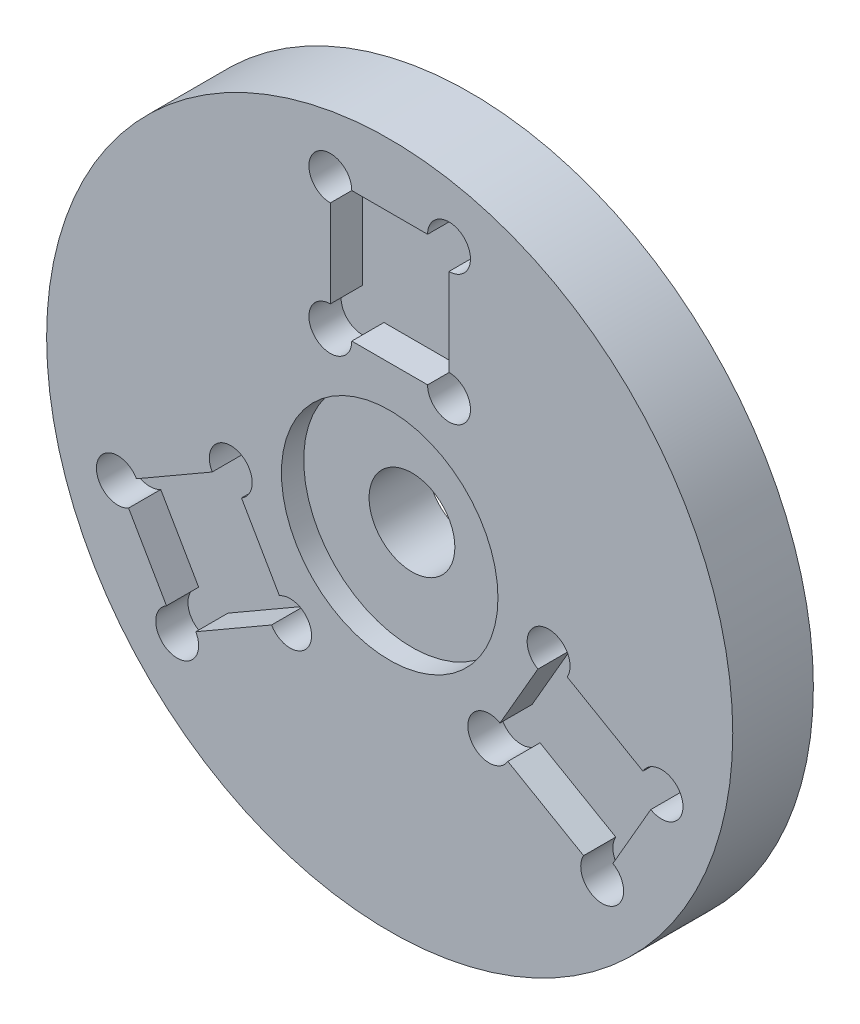
ISO-10303-21;
HEADER;
FILE_DESCRIPTION(('STEP AP214'),'2;1');
FILE_NAME('part.step','',(''),(''),'','','');
FILE_SCHEMA(('AUTOMOTIVE_DESIGN { 1 0 10303 214 1 1 1 1 }'));
ENDSEC;
DATA;
#1=APPLICATION_CONTEXT('core data for automotive mechanical design processes');
#2=APPLICATION_PROTOCOL_DEFINITION('international standard','automotive_design',2000,#1);
#3=PRODUCT_CONTEXT('',#1,'mechanical');
#4=PRODUCT('Part','Part','',(#3));
#5=PRODUCT_RELATED_PRODUCT_CATEGORY('part','',(#4));
#6=PRODUCT_DEFINITION_FORMATION('','',#4);
#7=PRODUCT_DEFINITION_CONTEXT('part definition',#1,'design');
#8=PRODUCT_DEFINITION('design','',#6,#7);
#9=PRODUCT_DEFINITION_SHAPE('','',#8);
#10=(LENGTH_UNIT() NAMED_UNIT(*) SI_UNIT(.MILLI.,.METRE.));
#11=(NAMED_UNIT(*) PLANE_ANGLE_UNIT() SI_UNIT($,.RADIAN.));
#12=(NAMED_UNIT(*) SI_UNIT($,.STERADIAN.) SOLID_ANGLE_UNIT());
#13=UNCERTAINTY_MEASURE_WITH_UNIT(LENGTH_MEASURE(1.E-05),#10,'distance_accuracy_value','');
#14=(GEOMETRIC_REPRESENTATION_CONTEXT(3) GLOBAL_UNCERTAINTY_ASSIGNED_CONTEXT((#13)) GLOBAL_UNIT_ASSIGNED_CONTEXT((#10,
#11,#12)) REPRESENTATION_CONTEXT('',''));
#15=CARTESIAN_POINT('',(0.,0.,0.));
#16=DIRECTION('',(0.,0.,1.));
#17=DIRECTION('',(1.,0.,0.));
#18=AXIS2_PLACEMENT_3D('',#15,#16,#17);
#19=CARTESIAN_POINT('',(0.,0.,11.938));
#20=DIRECTION('',(0.,0.,-1.));
#21=DIRECTION('',(-1.,0.,0.));
#22=AXIS2_PLACEMENT_3D('',#19,#20,#21);
#23=CYLINDRICAL_SURFACE('',#22,50.8);
#24=CARTESIAN_POINT('',(0.,0.,11.938));
#25=DIRECTION('',(0.,0.,1.));
#26=DIRECTION('',(1.,0.,0.));
#27=AXIS2_PLACEMENT_3D('',#24,#25,#26);
#28=CIRCLE('',#27,50.8);
#29=CARTESIAN_POINT('',(50.8,0.,11.938));
#30=VERTEX_POINT('',#29);
#31=EDGE_CURVE('E11',#30,#30,#28,.T.);
#32=ORIENTED_EDGE('',*,*,#31,.F.);
#33=EDGE_LOOP('',(#32));
#34=FACE_BOUND('',#33,.T.);
#35=CARTESIAN_POINT('',(0.,0.,0.));
#36=DIRECTION('',(0.,0.,1.));
#37=DIRECTION('',(1.,0.,0.));
#38=AXIS2_PLACEMENT_3D('',#35,#36,#37);
#39=CIRCLE('',#38,50.8);
#40=CARTESIAN_POINT('',(50.8,0.,0.));
#41=VERTEX_POINT('',#40);
#42=EDGE_CURVE('E40',#41,#41,#39,.T.);
#43=ORIENTED_EDGE('',*,*,#42,.T.);
#44=EDGE_LOOP('',(#43));
#45=FACE_BOUND('',#44,.T.);
#46=ADVANCED_FACE('F32',(#34,#45),#23,.T.);
#47=CARTESIAN_POINT('',(0.,0.,11.938));
#48=DIRECTION('',(0.,0.,1.));
#49=DIRECTION('',(1.,0.,0.));
#50=AXIS2_PLACEMENT_3D('',#47,#48,#49);
#51=PLANE('',#50);
#52=CARTESIAN_POINT('',(-14.7435993349946,-18.6593368653508,11.938));
#53=DIRECTION('',(0.,0.,1.));
#54=DIRECTION('',(-0.499999999999992,0.866025403784443,0.));
#55=AXIS2_PLACEMENT_3D('',#52,#53,#54);
#56=CIRCLE('',#55,3.175);
#57=CARTESIAN_POINT('',(-17.4932299920102,-20.2468368653508,11.938));
#58=VERTEX_POINT('',#57);
#59=CARTESIAN_POINT('',(-16.3310993349946,-15.9097062083352,11.938));
#60=VERTEX_POINT('',#59);
#61=EDGE_CURVE('E202',#58,#60,#56,.T.);
#62=ORIENTED_EDGE('',*,*,#61,.F.);
#63=DIRECTION('',(0.866025403784443,0.499999999999992,0.));
#64=VECTOR('',#63,1.);
#65=CARTESIAN_POINT('',(-31.4613537296495,-28.3113368653507,11.938));
#66=LINE('',#65,#64);
#67=CARTESIAN_POINT('',(-28.7117230726339,-26.7238368653507,11.938));
#68=VERTEX_POINT('',#67);
#69=EDGE_CURVE('E211',#68,#58,#66,.T.);
#70=ORIENTED_EDGE('',*,*,#69,.F.);
#71=CARTESIAN_POINT('',(-31.4613537296495,-28.3113368653507,11.938));
#72=DIRECTION('',(0.,0.,1.));
#73=DIRECTION('',(-0.499999999999992,0.866025403784443,0.));
#74=AXIS2_PLACEMENT_3D('',#71,#72,#73);
#75=CIRCLE('',#74,3.175);
#76=CARTESIAN_POINT('',(-33.0488537296495,-25.5617062083351,11.938));
#77=VERTEX_POINT('',#76);
#78=EDGE_CURVE('E678',#77,#68,#75,.T.);
#79=ORIENTED_EDGE('',*,*,#78,.F.);
#80=DIRECTION('',(0.499999999999992,-0.866025403784443,0.));
#81=VECTOR('',#80,1.);
#82=CARTESIAN_POINT('',(-31.4613537296495,-28.3113368653507,11.938));
#83=LINE('',#82,#81);
#84=CARTESIAN_POINT('',(-38.6615138053176,-15.8402937916643,11.938));
#85=VERTEX_POINT('',#84);
#86=EDGE_CURVE('E228',#85,#77,#83,.T.);
#87=ORIENTED_EDGE('',*,*,#86,.F.);
#88=CARTESIAN_POINT('',(-40.2490138053176,-13.0906631346487,11.938));
#89=DIRECTION('',(0.,0.,1.));
#90=DIRECTION('',(-0.499999999999992,0.866025403784443,0.));
#91=AXIS2_PLACEMENT_3D('',#88,#89,#90);
#92=CIRCLE('',#91,3.175);
#93=CARTESIAN_POINT('',(-37.499383148302,-11.5031631346487,11.938));
#94=VERTEX_POINT('',#93);
#95=EDGE_CURVE('E669',#94,#85,#92,.T.);
#96=ORIENTED_EDGE('',*,*,#95,.F.);
#97=DIRECTION('',(-0.866025403784443,-0.499999999999992,0.));
#98=VECTOR('',#97,1.);
#99=CARTESIAN_POINT('',(-40.2490138053176,-13.0906631346487,11.938));
#100=LINE('',#99,#98);
#101=CARTESIAN_POINT('',(-26.2808900676783,-5.0261631346488,11.938));
#102=VERTEX_POINT('',#101);
#103=EDGE_CURVE('E226',#102,#94,#100,.T.);
#104=ORIENTED_EDGE('',*,*,#103,.F.);
#105=CARTESIAN_POINT('',(-23.5312594106627,-3.43866313464882,11.938));
#106=DIRECTION('',(0.,0.,1.));
#107=DIRECTION('',(-0.499999999999992,0.866025403784443,0.));
#108=AXIS2_PLACEMENT_3D('',#105,#106,#107);
#109=CIRCLE('',#108,3.175);
#110=CARTESIAN_POINT('',(-21.9437594106627,-6.18829379166443,11.938));
#111=VERTEX_POINT('',#110);
#112=EDGE_CURVE('E658',#111,#102,#109,.T.);
#113=ORIENTED_EDGE('',*,*,#112,.F.);
#114=DIRECTION('',(-0.499999999999992,0.866025403784443,0.));
#115=VECTOR('',#114,1.);
#116=CARTESIAN_POINT('',(-14.7435993349946,-18.6593368653508,11.938));
#117=LINE('',#116,#115);
#118=EDGE_CURVE('E232',#60,#111,#117,.T.);
#119=ORIENTED_EDGE('',*,*,#118,.F.);
#120=EDGE_LOOP('',(#62,#70,#79,#87,#96,#104,#113,#119));
#121=FACE_BOUND('',#120,.T.);
#122=CARTESIAN_POINT('',(23.5312594106626,-3.43866313464915,11.938));
#123=DIRECTION('',(0.,0.,1.));
#124=DIRECTION('',(-0.500000000000004,-0.866025403784436,0.));
#125=AXIS2_PLACEMENT_3D('',#122,#123,#124);
#126=CIRCLE('',#125,3.175);
#127=CARTESIAN_POINT('',(26.2808900676782,-5.02616313464916,11.938));
#128=VERTEX_POINT('',#127);
#129=CARTESIAN_POINT('',(21.9437594106626,-6.18829379166474,11.938));
#130=VERTEX_POINT('',#129);
#131=EDGE_CURVE('E686',#128,#130,#126,.T.);
#132=ORIENTED_EDGE('',*,*,#131,.F.);
#133=DIRECTION('',(-0.866025403784436,0.500000000000004,0.));
#134=VECTOR('',#133,1.);
#135=CARTESIAN_POINT('',(40.2490138053174,-13.0906631346492,11.938));
#136=LINE('',#135,#134);
#137=CARTESIAN_POINT('',(37.4993831483018,-11.5031631346492,11.938));
#138=VERTEX_POINT('',#137);
#139=EDGE_CURVE('E248',#138,#128,#136,.T.);
#140=ORIENTED_EDGE('',*,*,#139,.F.);
#141=CARTESIAN_POINT('',(40.2490138053174,-13.0906631346492,11.938));
#142=DIRECTION('',(0.,0.,1.));
#143=DIRECTION('',(-0.500000000000004,-0.866025403784436,0.));
#144=AXIS2_PLACEMENT_3D('',#141,#142,#143);
#145=CIRCLE('',#144,3.175);
#146=CARTESIAN_POINT('',(38.6615138053174,-15.8402937916648,11.938));
#147=VERTEX_POINT('',#146);
#148=EDGE_CURVE('E716',#147,#138,#145,.T.);
#149=ORIENTED_EDGE('',*,*,#148,.F.);
#150=DIRECTION('',(0.500000000000004,0.866025403784436,0.));
#151=VECTOR('',#150,1.);
#152=CARTESIAN_POINT('',(40.2490138053174,-13.0906631346492,11.938));
#153=LINE('',#152,#151);
#154=CARTESIAN_POINT('',(33.0488537296491,-25.5617062083355,11.938));
#155=VERTEX_POINT('',#154);
#156=EDGE_CURVE('E246',#155,#147,#153,.T.);
#157=ORIENTED_EDGE('',*,*,#156,.F.);
#158=CARTESIAN_POINT('',(31.4613537296491,-28.3113368653511,11.938));
#159=DIRECTION('',(0.,0.,1.));
#160=DIRECTION('',(-0.500000000000004,-0.866025403784436,0.));
#161=AXIS2_PLACEMENT_3D('',#158,#159,#160);
#162=CIRCLE('',#161,3.175);
#163=CARTESIAN_POINT('',(28.7117230726335,-26.7238368653511,11.938));
#164=VERTEX_POINT('',#163);
#165=EDGE_CURVE('E707',#164,#155,#162,.T.);
#166=ORIENTED_EDGE('',*,*,#165,.F.);
#167=DIRECTION('',(0.866025403784437,-0.500000000000004,0.));
#168=VECTOR('',#167,1.);
#169=CARTESIAN_POINT('',(31.4613537296491,-28.3113368653511,11.938));
#170=LINE('',#169,#168);
#171=CARTESIAN_POINT('',(17.4932299920099,-20.246836865351,11.938));
#172=VERTEX_POINT('',#171);
#173=EDGE_CURVE('E220',#172,#164,#170,.T.);
#174=ORIENTED_EDGE('',*,*,#173,.F.);
#175=CARTESIAN_POINT('',(14.7435993349943,-18.659336865351,11.938));
#176=DIRECTION('',(0.,0.,1.));
#177=DIRECTION('',(-0.500000000000004,-0.866025403784436,0.));
#178=AXIS2_PLACEMENT_3D('',#175,#176,#177);
#179=CIRCLE('',#178,3.175);
#180=CARTESIAN_POINT('',(16.3310993349943,-15.9097062083354,11.938));
#181=VERTEX_POINT('',#180);
#182=EDGE_CURVE('E696',#181,#172,#179,.T.);
#183=ORIENTED_EDGE('',*,*,#182,.F.);
#184=DIRECTION('',(-0.500000000000004,-0.866025403784436,0.));
#185=VECTOR('',#184,1.);
#186=CARTESIAN_POINT('',(23.5312594106626,-3.43866313464915,11.938));
#187=LINE('',#186,#185);
#188=EDGE_CURVE('E237',#130,#181,#187,.T.);
#189=ORIENTED_EDGE('',*,*,#188,.F.);
#190=EDGE_LOOP('',(#132,#140,#149,#157,#166,#174,#183,#189));
#191=FACE_BOUND('',#190,.T.);
#192=CARTESIAN_POINT('',(-8.78766007566822,22.098,11.938));
#193=DIRECTION('',(0.,0.,1.));
#194=DIRECTION('',(1.,0.,0.));
#195=AXIS2_PLACEMENT_3D('',#192,#193,#194);
#196=CIRCLE('',#195,3.175);
#197=CARTESIAN_POINT('',(-8.78766007566822,25.273,11.938));
#198=VERTEX_POINT('',#197);
#199=CARTESIAN_POINT('',(-5.61266007566822,22.098,11.938));
#200=VERTEX_POINT('',#199);
#201=EDGE_CURVE('E244',#198,#200,#196,.T.);
#202=ORIENTED_EDGE('',*,*,#201,.F.);
#203=DIRECTION('',(0.,-1.,0.));
#204=VECTOR('',#203,1.);
#205=CARTESIAN_POINT('',(-8.78766007566822,41.402,11.938));
#206=LINE('',#205,#204);
#207=CARTESIAN_POINT('',(-8.78766007566822,38.227,11.938));
#208=VERTEX_POINT('',#207);
#209=EDGE_CURVE('E309',#208,#198,#206,.T.);
#210=ORIENTED_EDGE('',*,*,#209,.F.);
#211=CARTESIAN_POINT('',(-8.78766007566822,41.402,11.938));
#212=DIRECTION('',(0.,0.,1.));
#213=DIRECTION('',(1.,0.,0.));
#214=AXIS2_PLACEMENT_3D('',#211,#212,#213);
#215=CIRCLE('',#214,3.175);
#216=CARTESIAN_POINT('',(-5.61266007566822,41.402,11.938));
#217=VERTEX_POINT('',#216);
#218=EDGE_CURVE('E283',#217,#208,#215,.T.);
#219=ORIENTED_EDGE('',*,*,#218,.F.);
#220=DIRECTION('',(-1.,0.,0.));
#221=VECTOR('',#220,1.);
#222=CARTESIAN_POINT('',(-8.78766007566822,41.402,11.938));
#223=LINE('',#222,#221);
#224=CARTESIAN_POINT('',(5.61266007566821,41.402,11.938));
#225=VERTEX_POINT('',#224);
#226=EDGE_CURVE('E307',#225,#217,#223,.T.);
#227=ORIENTED_EDGE('',*,*,#226,.F.);
#228=CARTESIAN_POINT('',(8.78766007566821,41.402,11.938));
#229=DIRECTION('',(0.,0.,1.));
#230=DIRECTION('',(1.,0.,0.));
#231=AXIS2_PLACEMENT_3D('',#228,#229,#230);
#232=CIRCLE('',#231,3.175);
#233=CARTESIAN_POINT('',(8.78766007566821,38.227,11.938));
#234=VERTEX_POINT('',#233);
#235=EDGE_CURVE('E272',#234,#225,#232,.T.);
#236=ORIENTED_EDGE('',*,*,#235,.F.);
#237=DIRECTION('',(0.,1.,0.));
#238=VECTOR('',#237,1.);
#239=CARTESIAN_POINT('',(8.78766007566821,41.402,11.938));
#240=LINE('',#239,#238);
#241=CARTESIAN_POINT('',(8.78766007566822,25.273,11.938));
#242=VERTEX_POINT('',#241);
#243=EDGE_CURVE('E294',#242,#234,#240,.T.);
#244=ORIENTED_EDGE('',*,*,#243,.F.);
#245=CARTESIAN_POINT('',(8.78766007566822,22.098,11.938));
#246=DIRECTION('',(0.,0.,1.));
#247=DIRECTION('',(1.,0.,0.));
#248=AXIS2_PLACEMENT_3D('',#245,#246,#247);
#249=CIRCLE('',#248,3.175);
#250=CARTESIAN_POINT('',(5.61266007566822,22.098,11.938));
#251=VERTEX_POINT('',#250);
#252=EDGE_CURVE('E261',#251,#242,#249,.T.);
#253=ORIENTED_EDGE('',*,*,#252,.F.);
#254=DIRECTION('',(1.,0.,0.));
#255=VECTOR('',#254,1.);
#256=CARTESIAN_POINT('',(-8.78766007566822,22.098,11.938));
#257=LINE('',#256,#255);
#258=EDGE_CURVE('E298',#200,#251,#257,.T.);
#259=ORIENTED_EDGE('',*,*,#258,.F.);
#260=EDGE_LOOP('',(#202,#210,#219,#227,#236,#244,#253,#259));
#261=FACE_BOUND('',#260,.T.);
#262=CARTESIAN_POINT('',(0.,0.,11.938));
#263=DIRECTION('',(0.,0.,1.));
#264=DIRECTION('',(1.,0.,0.));
#265=AXIS2_PLACEMENT_3D('',#262,#263,#264);
#266=CIRCLE('',#265,16.03375);
#267=CARTESIAN_POINT('',(16.03375,0.,11.938));
#268=VERTEX_POINT('',#267);
#269=EDGE_CURVE('E305',#268,#268,#266,.T.);
#270=ORIENTED_EDGE('',*,*,#269,.F.);
#271=EDGE_LOOP('',(#270));
#272=FACE_BOUND('',#271,.T.);
#273=ORIENTED_EDGE('',*,*,#31,.T.);
#274=EDGE_LOOP('',(#273));
#275=FACE_BOUND('',#274,.T.);
#276=ADVANCED_FACE('F324',(#121,#191,#261,#272,#275),#51,.T.);
#277=CARTESIAN_POINT('',(0.,0.,0.));
#278=DIRECTION('',(0.,0.,1.));
#279=DIRECTION('',(1.,0.,0.));
#280=AXIS2_PLACEMENT_3D('',#277,#278,#279);
#281=PLANE('',#280);
#282=CARTESIAN_POINT('',(0.,0.,0.));
#283=DIRECTION('',(0.,0.,1.));
#284=DIRECTION('',(1.,0.,0.));
#285=AXIS2_PLACEMENT_3D('',#282,#283,#284);
#286=CIRCLE('',#285,6.35);
#287=CARTESIAN_POINT('',(6.35,0.,0.));
#288=VERTEX_POINT('',#287);
#289=EDGE_CURVE('E653',#288,#288,#286,.T.);
#290=ORIENTED_EDGE('',*,*,#289,.T.);
#291=EDGE_LOOP('',(#290));
#292=FACE_BOUND('',#291,.T.);
#293=ORIENTED_EDGE('',*,*,#42,.F.);
#294=EDGE_LOOP('',(#293));
#295=FACE_BOUND('',#294,.T.);
#296=ADVANCED_FACE('F321',(#292,#295),#281,.F.);
#297=CARTESIAN_POINT('',(0.,0.,8.636));
#298=DIRECTION('',(0.,0.,1.));
#299=DIRECTION('',(1.,0.,0.));
#300=AXIS2_PLACEMENT_3D('',#297,#298,#299);
#301=CYLINDRICAL_SURFACE('',#300,16.03375);
#302=CARTESIAN_POINT('',(0.,0.,8.636));
#303=DIRECTION('',(0.,0.,1.));
#304=DIRECTION('',(1.,0.,0.));
#305=AXIS2_PLACEMENT_3D('',#302,#303,#304);
#306=CIRCLE('',#305,16.03375);
#307=CARTESIAN_POINT('',(16.03375,0.,8.636));
#308=VERTEX_POINT('',#307);
#309=EDGE_CURVE('E313',#308,#308,#306,.T.);
#310=CARTESIAN_POINT('',(16.03375,0.,8.636));
#311=CARTESIAN_POINT('',(16.03375,0.,8.67039583333333));
#312=CARTESIAN_POINT('',(16.03375,0.,8.70479166666667));
#313=CARTESIAN_POINT('',(16.03375,0.,8.77358333333333));
#314=CARTESIAN_POINT('',(16.03375,0.,8.80797916666667));
#315=CARTESIAN_POINT('',(16.03375,0.,8.87677083333333));
#316=CARTESIAN_POINT('',(16.03375,0.,8.91116666666667));
#317=CARTESIAN_POINT('',(16.03375,0.,8.97995833333333));
#318=CARTESIAN_POINT('',(16.03375,0.,9.01435416666667));
#319=CARTESIAN_POINT('',(16.03375,0.,9.08314583333333));
#320=CARTESIAN_POINT('',(16.03375,0.,9.11754166666667));
#321=CARTESIAN_POINT('',(16.03375,0.,9.18633333333333));
#322=CARTESIAN_POINT('',(16.03375,0.,9.22072916666666));
#323=CARTESIAN_POINT('',(16.03375,0.,9.28952083333333));
#324=CARTESIAN_POINT('',(16.03375,0.,9.32391666666667));
#325=CARTESIAN_POINT('',(16.03375,0.,9.39270833333333));
#326=CARTESIAN_POINT('',(16.03375,0.,9.42710416666666));
#327=CARTESIAN_POINT('',(16.03375,0.,9.49589583333333));
#328=CARTESIAN_POINT('',(16.03375,0.,9.53029166666667));
#329=CARTESIAN_POINT('',(16.03375,0.,9.59908333333333));
#330=CARTESIAN_POINT('',(16.03375,0.,9.63347916666667));
#331=CARTESIAN_POINT('',(16.03375,0.,9.70227083333333));
#332=CARTESIAN_POINT('',(16.03375,0.,9.73666666666667));
#333=CARTESIAN_POINT('',(16.03375,0.,9.80545833333333));
#334=CARTESIAN_POINT('',(16.03375,0.,9.83985416666667));
#335=CARTESIAN_POINT('',(16.03375,0.,9.90864583333333));
#336=CARTESIAN_POINT('',(16.03375,0.,9.94304166666667));
#337=CARTESIAN_POINT('',(16.03375,0.,10.0118333333333));
#338=CARTESIAN_POINT('',(16.03375,0.,10.0462291666667));
#339=CARTESIAN_POINT('',(16.03375,0.,10.1150208333333));
#340=CARTESIAN_POINT('',(16.03375,0.,10.1494166666667));
#341=CARTESIAN_POINT('',(16.03375,0.,10.2182083333333));
#342=CARTESIAN_POINT('',(16.03375,0.,10.2526041666667));
#343=CARTESIAN_POINT('',(16.03375,0.,10.3213958333333));
#344=CARTESIAN_POINT('',(16.03375,0.,10.3557916666667));
#345=CARTESIAN_POINT('',(16.03375,0.,10.4245833333333));
#346=CARTESIAN_POINT('',(16.03375,0.,10.4589791666667));
#347=CARTESIAN_POINT('',(16.03375,0.,10.5277708333333));
#348=CARTESIAN_POINT('',(16.03375,0.,10.5621666666667));
#349=CARTESIAN_POINT('',(16.03375,0.,10.6309583333333));
#350=CARTESIAN_POINT('',(16.03375,0.,10.6653541666667));
#351=CARTESIAN_POINT('',(16.03375,0.,10.7341458333333));
#352=CARTESIAN_POINT('',(16.03375,0.,10.7685416666667));
#353=CARTESIAN_POINT('',(16.03375,0.,10.8373333333333));
#354=CARTESIAN_POINT('',(16.03375,0.,10.8717291666667));
#355=CARTESIAN_POINT('',(16.03375,0.,10.9405208333333));
#356=CARTESIAN_POINT('',(16.03375,0.,10.9749166666667));
#357=CARTESIAN_POINT('',(16.03375,0.,11.0437083333333));
#358=CARTESIAN_POINT('',(16.03375,0.,11.0781041666667));
#359=CARTESIAN_POINT('',(16.03375,0.,11.1468958333333));
#360=CARTESIAN_POINT('',(16.03375,0.,11.1812916666667));
#361=CARTESIAN_POINT('',(16.03375,0.,11.2500833333333));
#362=CARTESIAN_POINT('',(16.03375,0.,11.2844791666667));
#363=CARTESIAN_POINT('',(16.03375,0.,11.3532708333333));
#364=CARTESIAN_POINT('',(16.03375,0.,11.3876666666667));
#365=CARTESIAN_POINT('',(16.03375,0.,11.4564583333333));
#366=CARTESIAN_POINT('',(16.03375,0.,11.4908541666667));
#367=CARTESIAN_POINT('',(16.03375,0.,11.5596458333333));
#368=CARTESIAN_POINT('',(16.03375,0.,11.5940416666667));
#369=CARTESIAN_POINT('',(16.03375,0.,11.6628333333333));
#370=CARTESIAN_POINT('',(16.03375,0.,11.6972291666667));
#371=CARTESIAN_POINT('',(16.03375,0.,11.7660208333333));
#372=CARTESIAN_POINT('',(16.03375,0.,11.8004166666667));
#373=CARTESIAN_POINT('',(16.03375,0.,11.8692083333333));
#374=CARTESIAN_POINT('',(16.03375,0.,11.9036041666667));
#375=CARTESIAN_POINT('',(16.03375,0.,11.938));
#376=B_SPLINE_CURVE_WITH_KNOTS('',3,(#310,#311,#312,#313,#314,#315,#316,#317,#318,#319,#320,
#321,#322,#323,#324,#325,#326,#327,#328,#329,#330,#331,#332,#333,#334,#335,#336,#337,#338,#339,
#340,#341,#342,#343,#344,#345,#346,#347,#348,#349,#350,#351,#352,#353,#354,#355,#356,#357,#358,
#359,#360,#361,#362,#363,#364,#365,#366,#367,#368,#369,#370,#371,#372,#373,#374,#375),
.UNSPECIFIED.,.F.,.F.,(4,2,2,2,2,2,2,2,2,2,2,2,2,2,2,2,2,2,2,2,2,2,2,2,2,2,2,2,2,2,2,2,4),(0.,
0.103187500000001,0.206375000000002,0.309562500000001,0.412750000000002,0.515937500000001,
0.619125000000002,0.722312500000001,0.825500000000002,0.928687500000001,1.031875,1.1350625,
1.23825,1.3414375,1.444625,1.5478125,1.651,1.7541875,1.857375,1.9605625,2.06375,2.1669375,
2.270125,2.3733125,2.4765,2.5796875,2.682875,2.7860625,2.88925,2.9924375,3.095625,3.1988125,
3.302),.UNSPECIFIED.);
#377=EDGE_CURVE('BSEAM323',#308,#268,#376,.T.);
#378=ORIENTED_EDGE('',*,*,#309,.F.);
#379=ORIENTED_EDGE('',*,*,#269,.T.);
#380=ORIENTED_EDGE('',*,*,#377,.T.);
#381=ORIENTED_EDGE('',*,*,#377,.F.);
#382=EDGE_LOOP('',(#378,#380,#379,#381));
#383=FACE_BOUND('',#382,.T.);
#384=ADVANCED_FACE('F323',(#383),#301,.F.);
#385=CARTESIAN_POINT('',(0.,0.,8.636));
#386=DIRECTION('',(0.,0.,1.));
#387=DIRECTION('',(1.,0.,0.));
#388=AXIS2_PLACEMENT_3D('',#385,#386,#387);
#389=PLANE('',#388);
#390=CARTESIAN_POINT('',(0.,0.,8.636));
#391=DIRECTION('',(0.,0.,1.));
#392=DIRECTION('',(1.,0.,0.));
#393=AXIS2_PLACEMENT_3D('',#390,#391,#392);
#394=CIRCLE('',#393,6.35);
#395=CARTESIAN_POINT('',(6.35,0.,8.636));
#396=VERTEX_POINT('',#395);
#397=EDGE_CURVE('E35',#396,#396,#394,.T.);
#398=ORIENTED_EDGE('',*,*,#397,.F.);
#399=EDGE_LOOP('',(#398));
#400=FACE_BOUND('',#399,.T.);
#401=ORIENTED_EDGE('',*,*,#309,.T.);
#402=EDGE_LOOP('',(#401));
#403=FACE_BOUND('',#402,.T.);
#404=ADVANCED_FACE('F331',(#400,#403),#389,.T.);
#405=CARTESIAN_POINT('',(8.78766007566821,41.402,7.1755));
#406=DIRECTION('',(1.,0.,0.));
#407=DIRECTION('',(0.,1.,0.));
#408=AXIS2_PLACEMENT_3D('',#405,#406,#407);
#409=PLANE('',#408);
#410=DIRECTION('',(0.,1.,0.));
#411=VECTOR('',#410,1.);
#412=CARTESIAN_POINT('',(8.78766007566821,41.402,7.1755));
#413=LINE('',#412,#411);
#414=CARTESIAN_POINT('',(8.78766007566822,25.273,7.1755));
#415=VERTEX_POINT('',#414);
#416=CARTESIAN_POINT('',(8.78766007566821,38.227,7.1755));
#417=VERTEX_POINT('',#416);
#418=EDGE_CURVE('E295',#415,#417,#413,.T.);
#419=ORIENTED_EDGE('',*,*,#418,.F.);
#420=DIRECTION('',(0.,0.,1.));
#421=VECTOR('',#420,1.);
#422=CARTESIAN_POINT('',(8.78766007566822,25.273,-1.80475612106916));
#423=LINE('',#422,#421);
#424=EDGE_CURVE('E269',#415,#242,#423,.T.);
#425=ORIENTED_EDGE('',*,*,#424,.T.);
#426=ORIENTED_EDGE('',*,*,#243,.T.);
#427=DIRECTION('',(0.,0.,1.));
#428=VECTOR('',#427,1.);
#429=CARTESIAN_POINT('',(8.78766007566821,38.227,-1.80475612106916));
#430=LINE('',#429,#428);
#431=EDGE_CURVE('E280',#234,#417,#430,.F.);
#432=ORIENTED_EDGE('',*,*,#431,.T.);
#433=EDGE_LOOP('',(#419,#425,#426,#432));
#434=FACE_BOUND('',#433,.T.);
#435=ADVANCED_FACE('F367',(#434),#409,.F.);
#436=CARTESIAN_POINT('',(-8.78766007566822,22.098,7.1755));
#437=DIRECTION('',(0.,-1.,0.));
#438=DIRECTION('',(0.,0.,-1.));
#439=AXIS2_PLACEMENT_3D('',#436,#437,#438);
#440=PLANE('',#439);
#441=DIRECTION('',(1.,0.,0.));
#442=VECTOR('',#441,1.);
#443=CARTESIAN_POINT('',(-8.78766007566822,22.098,7.1755));
#444=LINE('',#443,#442);
#445=CARTESIAN_POINT('',(-5.61266007566822,22.098,7.1755));
#446=VERTEX_POINT('',#445);
#447=CARTESIAN_POINT('',(5.61266007566822,22.098,7.1755));
#448=VERTEX_POINT('',#447);
#449=EDGE_CURVE('E303',#446,#448,#444,.T.);
#450=ORIENTED_EDGE('',*,*,#449,.F.);
#451=DIRECTION('',(0.,0.,1.));
#452=VECTOR('',#451,1.);
#453=CARTESIAN_POINT('',(-5.61266007566822,22.098,-1.80475612106916));
#454=LINE('',#453,#452);
#455=EDGE_CURVE('E258',#446,#200,#454,.T.);
#456=ORIENTED_EDGE('',*,*,#455,.T.);
#457=ORIENTED_EDGE('',*,*,#258,.T.);
#458=DIRECTION('',(0.,0.,1.));
#459=VECTOR('',#458,1.);
#460=CARTESIAN_POINT('',(5.61266007566822,22.098,-1.80475612106916));
#461=LINE('',#460,#459);
#462=EDGE_CURVE('E266',#251,#448,#461,.F.);
#463=ORIENTED_EDGE('',*,*,#462,.T.);
#464=EDGE_LOOP('',(#450,#456,#457,#463));
#465=FACE_BOUND('',#464,.T.);
#466=ADVANCED_FACE('F377',(#465),#440,.F.);
#467=CARTESIAN_POINT('',(-8.78766007566822,41.402,7.1755));
#468=DIRECTION('',(-1.,0.,0.));
#469=DIRECTION('',(0.,-1.,0.));
#470=AXIS2_PLACEMENT_3D('',#467,#468,#469);
#471=PLANE('',#470);
#472=ORIENTED_EDGE('',*,*,#209,.T.);
#473=DIRECTION('',(0.,0.,1.));
#474=VECTOR('',#473,1.);
#475=CARTESIAN_POINT('',(-8.78766007566822,25.273,-1.80475612106916));
#476=LINE('',#475,#474);
#477=CARTESIAN_POINT('',(-8.78766007566822,25.273,7.1755));
#478=VERTEX_POINT('',#477);
#479=EDGE_CURVE('E255',#198,#478,#476,.F.);
#480=ORIENTED_EDGE('',*,*,#479,.T.);
#481=DIRECTION('',(0.,-1.,0.));
#482=VECTOR('',#481,1.);
#483=CARTESIAN_POINT('',(-8.78766007566822,41.402,7.1755));
#484=LINE('',#483,#482);
#485=CARTESIAN_POINT('',(-8.78766007566822,38.227,7.1755));
#486=VERTEX_POINT('',#485);
#487=EDGE_CURVE('E300',#486,#478,#484,.T.);
#488=ORIENTED_EDGE('',*,*,#487,.F.);
#489=DIRECTION('',(0.,0.,1.));
#490=VECTOR('',#489,1.);
#491=CARTESIAN_POINT('',(-8.78766007566822,38.227,-1.80475612106916));
#492=LINE('',#491,#490);
#493=EDGE_CURVE('E291',#486,#208,#492,.T.);
#494=ORIENTED_EDGE('',*,*,#493,.T.);
#495=EDGE_LOOP('',(#472,#480,#488,#494));
#496=FACE_BOUND('',#495,.T.);
#497=ADVANCED_FACE('F384',(#496),#471,.F.);
#498=CARTESIAN_POINT('',(-8.78766007566822,41.402,7.1755));
#499=DIRECTION('',(0.,1.,0.));
#500=DIRECTION('',(0.,0.,1.));
#501=AXIS2_PLACEMENT_3D('',#498,#499,#500);
#502=PLANE('',#501);
#503=DIRECTION('',(-1.,0.,0.));
#504=VECTOR('',#503,1.);
#505=CARTESIAN_POINT('',(-8.78766007566822,41.402,7.1755));
#506=LINE('',#505,#504);
#507=CARTESIAN_POINT('',(5.61266007566821,41.402,7.1755));
#508=VERTEX_POINT('',#507);
#509=CARTESIAN_POINT('',(-5.61266007566822,41.402,7.1755));
#510=VERTEX_POINT('',#509);
#511=EDGE_CURVE('E297',#508,#510,#506,.T.);
#512=ORIENTED_EDGE('',*,*,#511,.F.);
#513=DIRECTION('',(0.,0.,1.));
#514=VECTOR('',#513,1.);
#515=CARTESIAN_POINT('',(5.61266007566821,41.402,-1.80475612106916));
#516=LINE('',#515,#514);
#517=EDGE_CURVE('E277',#508,#225,#516,.T.);
#518=ORIENTED_EDGE('',*,*,#517,.T.);
#519=ORIENTED_EDGE('',*,*,#226,.T.);
#520=DIRECTION('',(0.,0.,1.));
#521=VECTOR('',#520,1.);
#522=CARTESIAN_POINT('',(-5.61266007566822,41.402,-1.80475612106916));
#523=LINE('',#522,#521);
#524=EDGE_CURVE('E288',#217,#510,#523,.F.);
#525=ORIENTED_EDGE('',*,*,#524,.T.);
#526=EDGE_LOOP('',(#512,#518,#519,#525));
#527=FACE_BOUND('',#526,.T.);
#528=ADVANCED_FACE('F392',(#527),#502,.F.);
#529=CARTESIAN_POINT('',(0.,0.,7.1755));
#530=DIRECTION('',(0.,0.,1.));
#531=DIRECTION('',(1.,0.,0.));
#532=AXIS2_PLACEMENT_3D('',#529,#530,#531);
#533=PLANE('',#532);
#534=CARTESIAN_POINT('',(-8.78766007566822,22.098,7.1755));
#535=DIRECTION('',(0.,0.,1.));
#536=DIRECTION('',(1.,0.,0.));
#537=AXIS2_PLACEMENT_3D('',#534,#535,#536);
#538=CIRCLE('',#537,3.175);
#539=EDGE_CURVE('E253',#446,#478,#538,.F.);
#540=ORIENTED_EDGE('',*,*,#539,.F.);
#541=ORIENTED_EDGE('',*,*,#449,.T.);
#542=CARTESIAN_POINT('',(8.78766007566822,22.098,7.1755));
#543=DIRECTION('',(0.,0.,1.));
#544=DIRECTION('',(1.,0.,0.));
#545=AXIS2_PLACEMENT_3D('',#542,#543,#544);
#546=CIRCLE('',#545,3.175);
#547=EDGE_CURVE('E263',#415,#448,#546,.F.);
#548=ORIENTED_EDGE('',*,*,#547,.F.);
#549=ORIENTED_EDGE('',*,*,#418,.T.);
#550=CARTESIAN_POINT('',(8.78766007566821,41.402,7.1755));
#551=DIRECTION('',(0.,0.,1.));
#552=DIRECTION('',(1.,0.,0.));
#553=AXIS2_PLACEMENT_3D('',#550,#551,#552);
#554=CIRCLE('',#553,3.175);
#555=EDGE_CURVE('E274',#508,#417,#554,.F.);
#556=ORIENTED_EDGE('',*,*,#555,.F.);
#557=ORIENTED_EDGE('',*,*,#511,.T.);
#558=CARTESIAN_POINT('',(-8.78766007566822,41.402,7.1755));
#559=DIRECTION('',(0.,0.,1.));
#560=DIRECTION('',(1.,0.,0.));
#561=AXIS2_PLACEMENT_3D('',#558,#559,#560);
#562=CIRCLE('',#561,3.175);
#563=EDGE_CURVE('E285',#486,#510,#562,.F.);
#564=ORIENTED_EDGE('',*,*,#563,.F.);
#565=ORIENTED_EDGE('',*,*,#487,.T.);
#566=EDGE_LOOP('',(#540,#541,#548,#549,#556,#557,#564,#565));
#567=FACE_BOUND('',#566,.T.);
#568=ADVANCED_FACE('F400',(#567),#533,.T.);
#569=CARTESIAN_POINT('',(-8.78766007566822,41.402,-1.80475612106916));
#570=DIRECTION('',(0.,0.,1.));
#571=DIRECTION('',(1.,0.,0.));
#572=AXIS2_PLACEMENT_3D('',#569,#570,#571);
#573=CYLINDRICAL_SURFACE('',#572,3.175);
#574=ORIENTED_EDGE('',*,*,#563,.T.);
#575=ORIENTED_EDGE('',*,*,#524,.F.);
#576=ORIENTED_EDGE('',*,*,#218,.T.);
#577=ORIENTED_EDGE('',*,*,#493,.F.);
#578=EDGE_LOOP('',(#574,#575,#576,#577));
#579=FACE_BOUND('',#578,.T.);
#580=ADVANCED_FACE('F408',(#579),#573,.F.);
#581=CARTESIAN_POINT('',(8.78766007566821,41.402,-1.80475612106916));
#582=DIRECTION('',(0.,0.,1.));
#583=DIRECTION('',(1.,0.,0.));
#584=AXIS2_PLACEMENT_3D('',#581,#582,#583);
#585=CYLINDRICAL_SURFACE('',#584,3.175);
#586=ORIENTED_EDGE('',*,*,#235,.T.);
#587=ORIENTED_EDGE('',*,*,#517,.F.);
#588=ORIENTED_EDGE('',*,*,#555,.T.);
#589=ORIENTED_EDGE('',*,*,#431,.F.);
#590=EDGE_LOOP('',(#586,#587,#588,#589));
#591=FACE_BOUND('',#590,.T.);
#592=ADVANCED_FACE('F416',(#591),#585,.F.);
#593=CARTESIAN_POINT('',(8.78766007566822,22.098,-1.80475612106916));
#594=DIRECTION('',(0.,0.,1.));
#595=DIRECTION('',(1.,0.,0.));
#596=AXIS2_PLACEMENT_3D('',#593,#594,#595);
#597=CYLINDRICAL_SURFACE('',#596,3.175);
#598=ORIENTED_EDGE('',*,*,#547,.T.);
#599=ORIENTED_EDGE('',*,*,#462,.F.);
#600=ORIENTED_EDGE('',*,*,#252,.T.);
#601=ORIENTED_EDGE('',*,*,#424,.F.);
#602=EDGE_LOOP('',(#598,#599,#600,#601));
#603=FACE_BOUND('',#602,.T.);
#604=ADVANCED_FACE('F424',(#603),#597,.F.);
#605=CARTESIAN_POINT('',(-8.78766007566822,22.098,-1.80475612106916));
#606=DIRECTION('',(0.,0.,1.));
#607=DIRECTION('',(1.,0.,0.));
#608=AXIS2_PLACEMENT_3D('',#605,#606,#607);
#609=CYLINDRICAL_SURFACE('',#608,3.175);
#610=ORIENTED_EDGE('',*,*,#539,.T.);
#611=ORIENTED_EDGE('',*,*,#479,.F.);
#612=ORIENTED_EDGE('',*,*,#201,.T.);
#613=ORIENTED_EDGE('',*,*,#455,.F.);
#614=EDGE_LOOP('',(#610,#611,#612,#613));
#615=FACE_BOUND('',#614,.T.);
#616=ADVANCED_FACE('F432',(#615),#609,.F.);
#617=CARTESIAN_POINT('',(31.4613537296491,-28.3113368653511,7.1755));
#618=DIRECTION('',(-0.500000000000004,-0.866025403784436,0.));
#619=DIRECTION('',(0.866025403784436,-0.500000000000004,0.));
#620=AXIS2_PLACEMENT_3D('',#617,#618,#619);
#621=PLANE('',#620);
#622=DIRECTION('',(0.866025403784437,-0.500000000000004,0.));
#623=VECTOR('',#622,1.);
#624=CARTESIAN_POINT('',(31.4613537296491,-28.3113368653511,7.1755));
#625=LINE('',#624,#623);
#626=CARTESIAN_POINT('',(17.4932299920099,-20.246836865351,7.1755));
#627=VERTEX_POINT('',#626);
#628=CARTESIAN_POINT('',(28.7117230726335,-26.7238368653511,7.1755));
#629=VERTEX_POINT('',#628);
#630=EDGE_CURVE('E234',#627,#629,#625,.T.);
#631=ORIENTED_EDGE('',*,*,#630,.F.);
#632=DIRECTION('',(0.,0.,1.));
#633=VECTOR('',#632,1.);
#634=CARTESIAN_POINT('',(17.4932299920099,-20.246836865351,-1.80475612106916));
#635=LINE('',#634,#633);
#636=EDGE_CURVE('E704',#627,#172,#635,.T.);
#637=ORIENTED_EDGE('',*,*,#636,.T.);
#638=ORIENTED_EDGE('',*,*,#173,.T.);
#639=DIRECTION('',(0.,0.,1.));
#640=VECTOR('',#639,1.);
#641=CARTESIAN_POINT('',(28.7117230726335,-26.7238368653511,-1.80475612106916));
#642=LINE('',#641,#640);
#643=EDGE_CURVE('E713',#164,#629,#642,.F.);
#644=ORIENTED_EDGE('',*,*,#643,.T.);
#645=EDGE_LOOP('',(#631,#637,#638,#644));
#646=FACE_BOUND('',#645,.T.);
#647=ADVANCED_FACE('F439',(#646),#621,.F.);
#648=CARTESIAN_POINT('',(23.5312594106626,-3.43866313464915,7.1755));
#649=DIRECTION('',(-0.866025403784436,0.500000000000004,0.));
#650=DIRECTION('',(-0.500000000000004,-0.866025403784436,0.));
#651=AXIS2_PLACEMENT_3D('',#648,#649,#650);
#652=PLANE('',#651);
#653=DIRECTION('',(-0.500000000000004,-0.866025403784436,0.));
#654=VECTOR('',#653,1.);
#655=CARTESIAN_POINT('',(23.5312594106626,-3.43866313464915,7.1755));
#656=LINE('',#655,#654);
#657=CARTESIAN_POINT('',(21.9437594106626,-6.18829379166474,7.1755));
#658=VERTEX_POINT('',#657);
#659=CARTESIAN_POINT('',(16.3310993349943,-15.9097062083354,7.1755));
#660=VERTEX_POINT('',#659);
#661=EDGE_CURVE('E242',#658,#660,#656,.T.);
#662=ORIENTED_EDGE('',*,*,#661,.F.);
#663=DIRECTION('',(0.,0.,1.));
#664=VECTOR('',#663,1.);
#665=CARTESIAN_POINT('',(21.9437594106626,-6.18829379166474,-1.80475612106916));
#666=LINE('',#665,#664);
#667=EDGE_CURVE('E693',#658,#130,#666,.T.);
#668=ORIENTED_EDGE('',*,*,#667,.T.);
#669=ORIENTED_EDGE('',*,*,#188,.T.);
#670=DIRECTION('',(0.,0.,1.));
#671=VECTOR('',#670,1.);
#672=CARTESIAN_POINT('',(16.3310993349943,-15.9097062083354,-1.80475612106916));
#673=LINE('',#672,#671);
#674=EDGE_CURVE('E701',#181,#660,#673,.F.);
#675=ORIENTED_EDGE('',*,*,#674,.T.);
#676=EDGE_LOOP('',(#662,#668,#669,#675));
#677=FACE_BOUND('',#676,.T.);
#678=ADVANCED_FACE('F446',(#677),#652,.F.);
#679=CARTESIAN_POINT('',(40.2490138053174,-13.0906631346492,7.1755));
#680=DIRECTION('',(0.500000000000004,0.866025403784436,0.));
#681=DIRECTION('',(-0.866025403784436,0.500000000000004,0.));
#682=AXIS2_PLACEMENT_3D('',#679,#680,#681);
#683=PLANE('',#682);
#684=ORIENTED_EDGE('',*,*,#139,.T.);
#685=DIRECTION('',(0.,0.,1.));
#686=VECTOR('',#685,1.);
#687=CARTESIAN_POINT('',(26.2808900676782,-5.02616313464916,-1.80475612106916));
#688=LINE('',#687,#686);
#689=CARTESIAN_POINT('',(26.2808900676782,-5.02616313464916,7.1755));
#690=VERTEX_POINT('',#689);
#691=EDGE_CURVE('E690',#128,#690,#688,.F.);
#692=ORIENTED_EDGE('',*,*,#691,.T.);
#693=DIRECTION('',(-0.866025403784436,0.500000000000004,0.));
#694=VECTOR('',#693,1.);
#695=CARTESIAN_POINT('',(40.2490138053174,-13.0906631346492,7.1755));
#696=LINE('',#695,#694);
#697=CARTESIAN_POINT('',(37.4993831483018,-11.5031631346492,7.1755));
#698=VERTEX_POINT('',#697);
#699=EDGE_CURVE('E239',#698,#690,#696,.T.);
#700=ORIENTED_EDGE('',*,*,#699,.F.);
#701=DIRECTION('',(0.,0.,1.));
#702=VECTOR('',#701,1.);
#703=CARTESIAN_POINT('',(37.4993831483018,-11.5031631346492,-1.80475612106916));
#704=LINE('',#703,#702);
#705=EDGE_CURVE('E229',#698,#138,#704,.T.);
#706=ORIENTED_EDGE('',*,*,#705,.T.);
#707=EDGE_LOOP('',(#684,#692,#700,#706));
#708=FACE_BOUND('',#707,.T.);
#709=ADVANCED_FACE('F454',(#708),#683,.F.);
#710=CARTESIAN_POINT('',(40.2490138053174,-13.0906631346492,7.1755));
#711=DIRECTION('',(0.866025403784436,-0.500000000000004,0.));
#712=DIRECTION('',(0.500000000000004,0.866025403784436,0.));
#713=AXIS2_PLACEMENT_3D('',#710,#711,#712);
#714=PLANE('',#713);
#715=DIRECTION('',(0.500000000000004,0.866025403784436,0.));
#716=VECTOR('',#715,1.);
#717=CARTESIAN_POINT('',(40.2490138053174,-13.0906631346492,7.1755));
#718=LINE('',#717,#716);
#719=CARTESIAN_POINT('',(33.0488537296491,-25.5617062083355,7.1755));
#720=VERTEX_POINT('',#719);
#721=CARTESIAN_POINT('',(38.6615138053174,-15.8402937916648,7.1755));
#722=VERTEX_POINT('',#721);
#723=EDGE_CURVE('E236',#720,#722,#718,.T.);
#724=ORIENTED_EDGE('',*,*,#723,.F.);
#725=DIRECTION('',(0.,0.,1.));
#726=VECTOR('',#725,1.);
#727=CARTESIAN_POINT('',(33.0488537296491,-25.5617062083355,-1.80475612106916));
#728=LINE('',#727,#726);
#729=EDGE_CURVE('E710',#720,#155,#728,.T.);
#730=ORIENTED_EDGE('',*,*,#729,.T.);
#731=ORIENTED_EDGE('',*,*,#156,.T.);
#732=DIRECTION('',(0.,0.,1.));
#733=VECTOR('',#732,1.);
#734=CARTESIAN_POINT('',(38.6615138053174,-15.8402937916648,-1.80475612106916));
#735=LINE('',#734,#733);
#736=EDGE_CURVE('E721',#147,#722,#735,.F.);
#737=ORIENTED_EDGE('',*,*,#736,.T.);
#738=EDGE_LOOP('',(#724,#730,#731,#737));
#739=FACE_BOUND('',#738,.T.);
#740=ADVANCED_FACE('F462',(#739),#714,.F.);
#741=CARTESIAN_POINT('',(0.,0.,7.1755));
#742=DIRECTION('',(0.,0.,1.));
#743=DIRECTION('',(-0.500000000000004,-0.866025403784436,0.));
#744=AXIS2_PLACEMENT_3D('',#741,#742,#743);
#745=PLANE('',#744);
#746=CARTESIAN_POINT('',(23.5312594106626,-3.43866313464915,7.1755));
#747=DIRECTION('',(0.,0.,1.));
#748=DIRECTION('',(1.,0.,0.));
#749=AXIS2_PLACEMENT_3D('',#746,#747,#748);
#750=CIRCLE('',#749,3.175);
#751=EDGE_CURVE('E688',#658,#690,#750,.F.);
#752=ORIENTED_EDGE('',*,*,#751,.F.);
#753=ORIENTED_EDGE('',*,*,#661,.T.);
#754=CARTESIAN_POINT('',(14.7435993349943,-18.659336865351,7.1755));
#755=DIRECTION('',(0.,0.,1.));
#756=DIRECTION('',(1.,0.,0.));
#757=AXIS2_PLACEMENT_3D('',#754,#755,#756);
#758=CIRCLE('',#757,3.175);
#759=EDGE_CURVE('E698',#627,#660,#758,.F.);
#760=ORIENTED_EDGE('',*,*,#759,.F.);
#761=ORIENTED_EDGE('',*,*,#630,.T.);
#762=CARTESIAN_POINT('',(31.4613537296491,-28.3113368653511,7.1755));
#763=DIRECTION('',(0.,0.,1.));
#764=DIRECTION('',(1.,0.,0.));
#765=AXIS2_PLACEMENT_3D('',#762,#763,#764);
#766=CIRCLE('',#765,3.175);
#767=EDGE_CURVE('E56',#720,#629,#766,.F.);
#768=ORIENTED_EDGE('',*,*,#767,.F.);
#769=ORIENTED_EDGE('',*,*,#723,.T.);
#770=CARTESIAN_POINT('',(40.2490138053174,-13.0906631346492,7.1755));
#771=DIRECTION('',(0.,0.,1.));
#772=DIRECTION('',(1.,0.,0.));
#773=AXIS2_PLACEMENT_3D('',#770,#771,#772);
#774=CIRCLE('',#773,3.175);
#775=EDGE_CURVE('E718',#698,#722,#774,.F.);
#776=ORIENTED_EDGE('',*,*,#775,.F.);
#777=ORIENTED_EDGE('',*,*,#699,.T.);
#778=EDGE_LOOP('',(#752,#753,#760,#761,#768,#769,#776,#777));
#779=FACE_BOUND('',#778,.T.);
#780=ADVANCED_FACE('F470',(#779),#745,.T.);
#781=CARTESIAN_POINT('',(-40.2490138053176,-13.0906631346487,7.1755));
#782=DIRECTION('',(-0.499999999999992,0.866025403784443,0.));
#783=DIRECTION('',(-0.866025403784443,-0.499999999999992,0.));
#784=AXIS2_PLACEMENT_3D('',#781,#782,#783);
#785=PLANE('',#784);
#786=DIRECTION('',(-0.866025403784443,-0.499999999999992,0.));
#787=VECTOR('',#786,1.);
#788=CARTESIAN_POINT('',(-40.2490138053176,-13.0906631346487,7.1755));
#789=LINE('',#788,#787);
#790=CARTESIAN_POINT('',(-26.2808900676783,-5.0261631346488,7.1755));
#791=VERTEX_POINT('',#790);
#792=CARTESIAN_POINT('',(-37.499383148302,-11.5031631346487,7.1755));
#793=VERTEX_POINT('',#792);
#794=EDGE_CURVE('E222',#791,#793,#789,.T.);
#795=ORIENTED_EDGE('',*,*,#794,.F.);
#796=DIRECTION('',(0.,0.,1.));
#797=VECTOR('',#796,1.);
#798=CARTESIAN_POINT('',(-26.2808900676783,-5.0261631346488,-1.80475612106916));
#799=LINE('',#798,#797);
#800=EDGE_CURVE('E666',#791,#102,#799,.T.);
#801=ORIENTED_EDGE('',*,*,#800,.T.);
#802=ORIENTED_EDGE('',*,*,#103,.T.);
#803=DIRECTION('',(0.,0.,1.));
#804=VECTOR('',#803,1.);
#805=CARTESIAN_POINT('',(-37.499383148302,-11.5031631346487,-1.80475612106916));
#806=LINE('',#805,#804);
#807=EDGE_CURVE('E675',#94,#793,#806,.F.);
#808=ORIENTED_EDGE('',*,*,#807,.T.);
#809=EDGE_LOOP('',(#795,#801,#802,#808));
#810=FACE_BOUND('',#809,.T.);
#811=ADVANCED_FACE('F478',(#810),#785,.F.);
#812=CARTESIAN_POINT('',(-14.7435993349946,-18.6593368653508,7.1755));
#813=DIRECTION('',(0.866025403784443,0.499999999999992,0.));
#814=DIRECTION('',(-0.499999999999992,0.866025403784443,0.));
#815=AXIS2_PLACEMENT_3D('',#812,#813,#814);
#816=PLANE('',#815);
#817=DIRECTION('',(-0.499999999999992,0.866025403784443,0.));
#818=VECTOR('',#817,1.);
#819=CARTESIAN_POINT('',(-14.7435993349946,-18.6593368653508,7.1755));
#820=LINE('',#819,#818);
#821=CARTESIAN_POINT('',(-16.3310993349946,-15.9097062083352,7.1755));
#822=VERTEX_POINT('',#821);
#823=CARTESIAN_POINT('',(-21.9437594106627,-6.18829379166443,7.1755));
#824=VERTEX_POINT('',#823);
#825=EDGE_CURVE('E217',#822,#824,#820,.T.);
#826=ORIENTED_EDGE('',*,*,#825,.F.);
#827=DIRECTION('',(0.,0.,1.));
#828=VECTOR('',#827,1.);
#829=CARTESIAN_POINT('',(-16.3310993349946,-15.9097062083352,-1.80475612106916));
#830=LINE('',#829,#828);
#831=EDGE_CURVE('E199',#822,#60,#830,.T.);
#832=ORIENTED_EDGE('',*,*,#831,.T.);
#833=ORIENTED_EDGE('',*,*,#118,.T.);
#834=DIRECTION('',(0.,0.,1.));
#835=VECTOR('',#834,1.);
#836=CARTESIAN_POINT('',(-21.9437594106627,-6.18829379166443,-1.80475612106916));
#837=LINE('',#836,#835);
#838=EDGE_CURVE('E663',#111,#824,#837,.F.);
#839=ORIENTED_EDGE('',*,*,#838,.T.);
#840=EDGE_LOOP('',(#826,#832,#833,#839));
#841=FACE_BOUND('',#840,.T.);
#842=ADVANCED_FACE('F485',(#841),#816,.F.);
#843=CARTESIAN_POINT('',(-31.4613537296495,-28.3113368653507,7.1755));
#844=DIRECTION('',(0.499999999999992,-0.866025403784443,0.));
#845=DIRECTION('',(0.866025403784443,0.499999999999992,0.));
#846=AXIS2_PLACEMENT_3D('',#843,#844,#845);
#847=PLANE('',#846);
#848=ORIENTED_EDGE('',*,*,#69,.T.);
#849=DIRECTION('',(0.,0.,1.));
#850=VECTOR('',#849,1.);
#851=CARTESIAN_POINT('',(-17.4932299920102,-20.2468368653508,-1.80475612106916));
#852=LINE('',#851,#850);
#853=CARTESIAN_POINT('',(-17.4932299920102,-20.2468368653508,7.1755));
#854=VERTEX_POINT('',#853);
#855=EDGE_CURVE('E196',#58,#854,#852,.F.);
#856=ORIENTED_EDGE('',*,*,#855,.T.);
#857=DIRECTION('',(0.866025403784443,0.499999999999992,0.));
#858=VECTOR('',#857,1.);
#859=CARTESIAN_POINT('',(-31.4613537296495,-28.3113368653507,7.1755));
#860=LINE('',#859,#858);
#861=CARTESIAN_POINT('',(-28.7117230726339,-26.7238368653507,7.1755));
#862=VERTEX_POINT('',#861);
#863=EDGE_CURVE('E209',#862,#854,#860,.T.);
#864=ORIENTED_EDGE('',*,*,#863,.F.);
#865=DIRECTION('',(0.,0.,1.));
#866=VECTOR('',#865,1.);
#867=CARTESIAN_POINT('',(-28.7117230726339,-26.7238368653507,-1.80475612106916));
#868=LINE('',#867,#866);
#869=EDGE_CURVE('E684',#862,#68,#868,.T.);
#870=ORIENTED_EDGE('',*,*,#869,.T.);
#871=EDGE_LOOP('',(#848,#856,#864,#870));
#872=FACE_BOUND('',#871,.T.);
#873=ADVANCED_FACE('F207',(#872),#847,.F.);
#874=CARTESIAN_POINT('',(-31.4613537296495,-28.3113368653507,7.1755));
#875=DIRECTION('',(-0.866025403784443,-0.499999999999992,0.));
#876=DIRECTION('',(0.499999999999992,-0.866025403784443,0.));
#877=AXIS2_PLACEMENT_3D('',#874,#875,#876);
#878=PLANE('',#877);
#879=DIRECTION('',(0.499999999999992,-0.866025403784443,0.));
#880=VECTOR('',#879,1.);
#881=CARTESIAN_POINT('',(-31.4613537296495,-28.3113368653507,7.1755));
#882=LINE('',#881,#880);
#883=CARTESIAN_POINT('',(-38.6615138053176,-15.8402937916643,7.1755));
#884=VERTEX_POINT('',#883);
#885=CARTESIAN_POINT('',(-33.0488537296495,-25.5617062083351,7.1755));
#886=VERTEX_POINT('',#885);
#887=EDGE_CURVE('E218',#884,#886,#882,.T.);
#888=ORIENTED_EDGE('',*,*,#887,.F.);
#889=DIRECTION('',(0.,0.,1.));
#890=VECTOR('',#889,1.);
#891=CARTESIAN_POINT('',(-38.6615138053176,-15.8402937916643,-1.80475612106916));
#892=LINE('',#891,#890);
#893=EDGE_CURVE('E672',#884,#85,#892,.T.);
#894=ORIENTED_EDGE('',*,*,#893,.T.);
#895=ORIENTED_EDGE('',*,*,#86,.T.);
#896=DIRECTION('',(0.,0.,1.));
#897=VECTOR('',#896,1.);
#898=CARTESIAN_POINT('',(-33.0488537296495,-25.5617062083351,-1.80475612106916));
#899=LINE('',#898,#897);
#900=EDGE_CURVE('E681',#77,#886,#899,.F.);
#901=ORIENTED_EDGE('',*,*,#900,.T.);
#902=EDGE_LOOP('',(#888,#894,#895,#901));
#903=FACE_BOUND('',#902,.T.);
#904=ADVANCED_FACE('F500',(#903),#878,.F.);
#905=CARTESIAN_POINT('',(0.,0.,7.1755));
#906=DIRECTION('',(0.,0.,1.));
#907=DIRECTION('',(-0.499999999999992,0.866025403784443,0.));
#908=AXIS2_PLACEMENT_3D('',#905,#906,#907);
#909=PLANE('',#908);
#910=CARTESIAN_POINT('',(-14.7435993349946,-18.6593368653508,7.1755));
#911=DIRECTION('',(0.,0.,1.));
#912=DIRECTION('',(1.,0.,0.));
#913=AXIS2_PLACEMENT_3D('',#910,#911,#912);
#914=CIRCLE('',#913,3.175);
#915=EDGE_CURVE('E193',#822,#854,#914,.F.);
#916=ORIENTED_EDGE('',*,*,#915,.F.);
#917=ORIENTED_EDGE('',*,*,#825,.T.);
#918=CARTESIAN_POINT('',(-23.5312594106627,-3.43866313464882,7.1755));
#919=DIRECTION('',(0.,0.,1.));
#920=DIRECTION('',(1.,0.,0.));
#921=AXIS2_PLACEMENT_3D('',#918,#919,#920);
#922=CIRCLE('',#921,3.175);
#923=EDGE_CURVE('E660',#791,#824,#922,.F.);
#924=ORIENTED_EDGE('',*,*,#923,.F.);
#925=ORIENTED_EDGE('',*,*,#794,.T.);
#926=CARTESIAN_POINT('',(-40.2490138053176,-13.0906631346487,7.1755));
#927=DIRECTION('',(0.,0.,1.));
#928=DIRECTION('',(1.,0.,0.));
#929=AXIS2_PLACEMENT_3D('',#926,#927,#928);
#930=CIRCLE('',#929,3.175);
#931=EDGE_CURVE('E48',#884,#793,#930,.F.);
#932=ORIENTED_EDGE('',*,*,#931,.F.);
#933=ORIENTED_EDGE('',*,*,#887,.T.);
#934=CARTESIAN_POINT('',(-31.4613537296495,-28.3113368653507,7.1755));
#935=DIRECTION('',(0.,0.,1.));
#936=DIRECTION('',(1.,0.,0.));
#937=AXIS2_PLACEMENT_3D('',#934,#935,#936);
#938=CIRCLE('',#937,3.175);
#939=EDGE_CURVE('E216',#862,#886,#938,.F.);
#940=ORIENTED_EDGE('',*,*,#939,.F.);
#941=ORIENTED_EDGE('',*,*,#863,.T.);
#942=EDGE_LOOP('',(#916,#917,#924,#925,#932,#933,#940,#941));
#943=FACE_BOUND('',#942,.T.);
#944=ADVANCED_FACE('F214',(#943),#909,.T.);
#945=CARTESIAN_POINT('',(40.2490138053174,-13.0906631346492,-1.80475612106916));
#946=DIRECTION('',(0.,0.,1.));
#947=DIRECTION('',(1.,0.,0.));
#948=AXIS2_PLACEMENT_3D('',#945,#946,#947);
#949=CYLINDRICAL_SURFACE('',#948,3.175);
#950=ORIENTED_EDGE('',*,*,#775,.T.);
#951=ORIENTED_EDGE('',*,*,#736,.F.);
#952=ORIENTED_EDGE('',*,*,#148,.T.);
#953=ORIENTED_EDGE('',*,*,#705,.F.);
#954=EDGE_LOOP('',(#950,#951,#952,#953));
#955=FACE_BOUND('',#954,.T.);
#956=ADVANCED_FACE('F514',(#955),#949,.F.);
#957=CARTESIAN_POINT('',(31.4613537296491,-28.3113368653511,-1.80475612106916));
#958=DIRECTION('',(0.,0.,1.));
#959=DIRECTION('',(1.,0.,0.));
#960=AXIS2_PLACEMENT_3D('',#957,#958,#959);
#961=CYLINDRICAL_SURFACE('',#960,3.175);
#962=ORIENTED_EDGE('',*,*,#165,.T.);
#963=ORIENTED_EDGE('',*,*,#729,.F.);
#964=ORIENTED_EDGE('',*,*,#767,.T.);
#965=ORIENTED_EDGE('',*,*,#643,.F.);
#966=EDGE_LOOP('',(#962,#963,#964,#965));
#967=FACE_BOUND('',#966,.T.);
#968=ADVANCED_FACE('F521',(#967),#961,.F.);
#969=CARTESIAN_POINT('',(14.7435993349943,-18.659336865351,-1.80475612106916));
#970=DIRECTION('',(0.,0.,1.));
#971=DIRECTION('',(1.,0.,0.));
#972=AXIS2_PLACEMENT_3D('',#969,#970,#971);
#973=CYLINDRICAL_SURFACE('',#972,3.175);
#974=ORIENTED_EDGE('',*,*,#759,.T.);
#975=ORIENTED_EDGE('',*,*,#674,.F.);
#976=ORIENTED_EDGE('',*,*,#182,.T.);
#977=ORIENTED_EDGE('',*,*,#636,.F.);
#978=EDGE_LOOP('',(#974,#975,#976,#977));
#979=FACE_BOUND('',#978,.T.);
#980=ADVANCED_FACE('F529',(#979),#973,.F.);
#981=CARTESIAN_POINT('',(23.5312594106626,-3.43866313464915,-1.80475612106916));
#982=DIRECTION('',(0.,0.,1.));
#983=DIRECTION('',(1.,0.,0.));
#984=AXIS2_PLACEMENT_3D('',#981,#982,#983);
#985=CYLINDRICAL_SURFACE('',#984,3.175);
#986=ORIENTED_EDGE('',*,*,#751,.T.);
#987=ORIENTED_EDGE('',*,*,#691,.F.);
#988=ORIENTED_EDGE('',*,*,#131,.T.);
#989=ORIENTED_EDGE('',*,*,#667,.F.);
#990=EDGE_LOOP('',(#986,#987,#988,#989));
#991=FACE_BOUND('',#990,.T.);
#992=ADVANCED_FACE('F537',(#991),#985,.F.);
#993=CARTESIAN_POINT('',(-31.4613537296495,-28.3113368653507,-1.80475612106916));
#994=DIRECTION('',(0.,0.,1.));
#995=DIRECTION('',(1.,0.,0.));
#996=AXIS2_PLACEMENT_3D('',#993,#994,#995);
#997=CYLINDRICAL_SURFACE('',#996,3.175);
#998=ORIENTED_EDGE('',*,*,#939,.T.);
#999=ORIENTED_EDGE('',*,*,#900,.F.);
#1000=ORIENTED_EDGE('',*,*,#78,.T.);
#1001=ORIENTED_EDGE('',*,*,#869,.F.);
#1002=EDGE_LOOP('',(#998,#999,#1000,#1001));
#1003=FACE_BOUND('',#1002,.T.);
#1004=ADVANCED_FACE('F545',(#1003),#997,.F.);
#1005=CARTESIAN_POINT('',(-40.2490138053176,-13.0906631346487,-1.80475612106916));
#1006=DIRECTION('',(0.,0.,1.));
#1007=DIRECTION('',(1.,0.,0.));
#1008=AXIS2_PLACEMENT_3D('',#1005,#1006,#1007);
#1009=CYLINDRICAL_SURFACE('',#1008,3.175);
#1010=ORIENTED_EDGE('',*,*,#95,.T.);
#1011=ORIENTED_EDGE('',*,*,#893,.F.);
#1012=ORIENTED_EDGE('',*,*,#931,.T.);
#1013=ORIENTED_EDGE('',*,*,#807,.F.);
#1014=EDGE_LOOP('',(#1010,#1011,#1012,#1013));
#1015=FACE_BOUND('',#1014,.T.);
#1016=ADVANCED_FACE('F553',(#1015),#1009,.F.);
#1017=CARTESIAN_POINT('',(-23.5312594106627,-3.43866313464882,-1.80475612106916));
#1018=DIRECTION('',(0.,0.,1.));
#1019=DIRECTION('',(1.,0.,0.));
#1020=AXIS2_PLACEMENT_3D('',#1017,#1018,#1019);
#1021=CYLINDRICAL_SURFACE('',#1020,3.175);
#1022=ORIENTED_EDGE('',*,*,#923,.T.);
#1023=ORIENTED_EDGE('',*,*,#838,.F.);
#1024=ORIENTED_EDGE('',*,*,#112,.T.);
#1025=ORIENTED_EDGE('',*,*,#800,.F.);
#1026=EDGE_LOOP('',(#1022,#1023,#1024,#1025));
#1027=FACE_BOUND('',#1026,.T.);
#1028=ADVANCED_FACE('F561',(#1027),#1021,.F.);
#1029=CARTESIAN_POINT('',(-14.7435993349946,-18.6593368653508,-1.80475612106916));
#1030=DIRECTION('',(0.,0.,1.));
#1031=DIRECTION('',(1.,0.,0.));
#1032=AXIS2_PLACEMENT_3D('',#1029,#1030,#1031);
#1033=CYLINDRICAL_SURFACE('',#1032,3.175);
#1034=ORIENTED_EDGE('',*,*,#915,.T.);
#1035=ORIENTED_EDGE('',*,*,#855,.F.);
#1036=ORIENTED_EDGE('',*,*,#61,.T.);
#1037=ORIENTED_EDGE('',*,*,#831,.F.);
#1038=EDGE_LOOP('',(#1034,#1035,#1036,#1037));
#1039=FACE_BOUND('',#1038,.T.);
#1040=ADVANCED_FACE('F195',(#1039),#1033,.F.);
#1041=CARTESIAN_POINT('',(0.,0.,0.));
#1042=DIRECTION('',(0.,0.,1.));
#1043=DIRECTION('',(1.,0.,0.));
#1044=AXIS2_PLACEMENT_3D('',#1041,#1042,#1043);
#1045=CYLINDRICAL_SURFACE('',#1044,6.35);
#1046=ORIENTED_EDGE('',*,*,#397,.T.);
#1047=EDGE_LOOP('',(#1046));
#1048=FACE_BOUND('',#1047,.T.);
#1049=ORIENTED_EDGE('',*,*,#289,.F.);
#1050=EDGE_LOOP('',(#1049));
#1051=FACE_BOUND('',#1050,.T.);
#1052=ADVANCED_FACE('F575',(#1048,#1051),#1045,.F.);
#1053=CLOSED_SHELL('',(#46,#276,#296,#384,#404,#435,#466,#497,#528,#568,#580,#592,#604,#616,
#647,#678,#709,#740,#780,#811,#842,#873,#904,#944,#956,#968,#980,#992,#1004,#1016,#1028,#1040,#1052));
#1054=MANIFOLD_SOLID_BREP('B2',#1053);
#1055=ADVANCED_BREP_SHAPE_REPRESENTATION('',(#18,#1054),#14);
#1056=SHAPE_DEFINITION_REPRESENTATION(#9,#1055);
ENDSEC;
END-ISO-10303-21;
